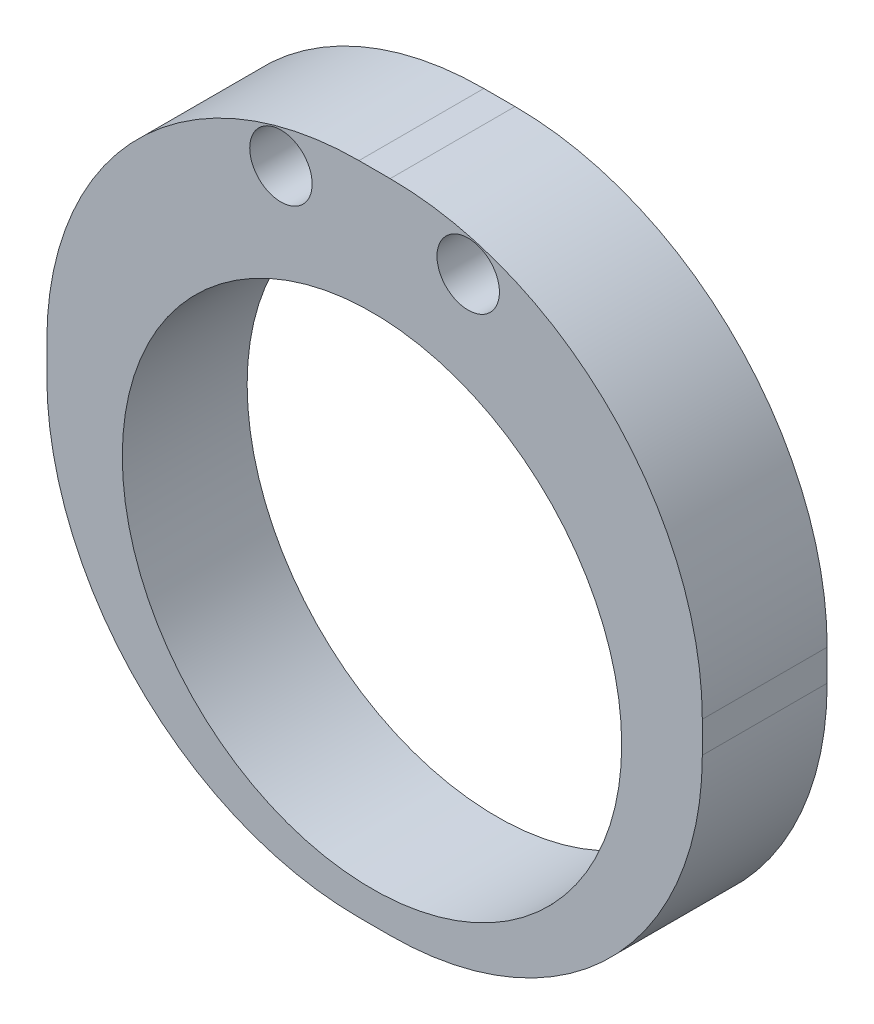
ISO-10303-21;
HEADER;
FILE_DESCRIPTION(('STEP AP214'),'2;1');
FILE_NAME('part.step','',(''),(''),'','','');
FILE_SCHEMA(('AUTOMOTIVE_DESIGN { 1 0 10303 214 1 1 1 1 }'));
ENDSEC;
DATA;
#1=APPLICATION_CONTEXT('core data for automotive mechanical design processes');
#2=APPLICATION_PROTOCOL_DEFINITION('international standard','automotive_design',2000,#1);
#3=PRODUCT_CONTEXT('',#1,'mechanical');
#4=PRODUCT('Part','Part','',(#3));
#5=PRODUCT_RELATED_PRODUCT_CATEGORY('part','',(#4));
#6=PRODUCT_DEFINITION_FORMATION('','',#4);
#7=PRODUCT_DEFINITION_CONTEXT('part definition',#1,'design');
#8=PRODUCT_DEFINITION('design','',#6,#7);
#9=PRODUCT_DEFINITION_SHAPE('','',#8);
#10=(LENGTH_UNIT() NAMED_UNIT(*) SI_UNIT(.MILLI.,.METRE.));
#11=(NAMED_UNIT(*) PLANE_ANGLE_UNIT() SI_UNIT($,.RADIAN.));
#12=(NAMED_UNIT(*) SI_UNIT($,.STERADIAN.) SOLID_ANGLE_UNIT());
#13=UNCERTAINTY_MEASURE_WITH_UNIT(LENGTH_MEASURE(1.E-05),#10,'distance_accuracy_value','');
#14=(GEOMETRIC_REPRESENTATION_CONTEXT(3) GLOBAL_UNCERTAINTY_ASSIGNED_CONTEXT((#13)) GLOBAL_UNIT_ASSIGNED_CONTEXT((#10,
#11,#12)) REPRESENTATION_CONTEXT('',''));
#15=CARTESIAN_POINT('',(0.,0.,0.));
#16=DIRECTION('',(0.,0.,1.));
#17=DIRECTION('',(1.,0.,0.));
#18=AXIS2_PLACEMENT_3D('',#15,#16,#17);
#19=CARTESIAN_POINT('',(-104.778504727155,56.6461722523179,20.));
#20=DIRECTION('',(1.,0.,0.));
#21=DIRECTION('',(0.,1.,0.));
#22=AXIS2_PLACEMENT_3D('',#19,#20,#21);
#23=PLANE('',#22);
#24=DIRECTION('',(0.,-1.,0.));
#25=VECTOR('',#24,1.);
#26=CARTESIAN_POINT('',(-104.778504727155,56.6461722523179,0.));
#27=LINE('',#26,#25);
#28=CARTESIAN_POINT('',(-104.778504727155,6.64617225231788,0.));
#29=VERTEX_POINT('',#28);
#30=CARTESIAN_POINT('',(-104.778504727155,1.64617225231788,0.));
#31=VERTEX_POINT('',#30);
#32=EDGE_CURVE('E159',#29,#31,#27,.T.);
#33=ORIENTED_EDGE('',*,*,#32,.T.);
#34=DIRECTION('',(0.,0.,-1.));
#35=VECTOR('',#34,1.);
#36=CARTESIAN_POINT('',(-104.778504727155,1.64617225231788,20.));
#37=LINE('',#36,#35);
#38=CARTESIAN_POINT('',(-104.778504727155,1.64617225231788,20.));
#39=VERTEX_POINT('',#38);
#40=EDGE_CURVE('E11',#31,#39,#37,.F.);
#41=ORIENTED_EDGE('',*,*,#40,.T.);
#42=DIRECTION('',(0.,-1.,0.));
#43=VECTOR('',#42,1.);
#44=CARTESIAN_POINT('',(-104.778504727155,56.6461722523179,20.));
#45=LINE('',#44,#43);
#46=CARTESIAN_POINT('',(-104.778504727155,6.64617225231788,20.));
#47=VERTEX_POINT('',#46);
#48=EDGE_CURVE('E127',#47,#39,#45,.T.);
#49=ORIENTED_EDGE('',*,*,#48,.F.);
#50=DIRECTION('',(0.,0.,-1.));
#51=VECTOR('',#50,1.);
#52=CARTESIAN_POINT('',(-104.778504727155,6.64617225231788,20.));
#53=LINE('',#52,#51);
#54=EDGE_CURVE('E43',#47,#29,#53,.T.);
#55=ORIENTED_EDGE('',*,*,#54,.T.);
#56=EDGE_LOOP('',(#33,#41,#49,#55));
#57=FACE_BOUND('',#56,.T.);
#58=ADVANCED_FACE('F35',(#57),#23,.F.);
#59=CARTESIAN_POINT('',(-104.778504727155,-48.3538277476821,20.));
#60=DIRECTION('',(0.,1.,0.));
#61=DIRECTION('',(0.,0.,1.));
#62=AXIS2_PLACEMENT_3D('',#59,#60,#61);
#63=PLANE('',#62);
#64=DIRECTION('',(1.,0.,0.));
#65=VECTOR('',#64,1.);
#66=CARTESIAN_POINT('',(-104.778504727155,-48.3538277476821,0.));
#67=LINE('',#66,#65);
#68=CARTESIAN_POINT('',(-54.7785047271554,-48.3538277476821,0.));
#69=VERTEX_POINT('',#68);
#70=CARTESIAN_POINT('',(-49.7785047271555,-48.3538277476821,0.));
#71=VERTEX_POINT('',#70);
#72=EDGE_CURVE('E132',#69,#71,#67,.T.);
#73=ORIENTED_EDGE('',*,*,#72,.T.);
#74=DIRECTION('',(0.,0.,-1.));
#75=VECTOR('',#74,1.);
#76=CARTESIAN_POINT('',(-49.7785047271555,-48.3538277476821,20.));
#77=LINE('',#76,#75);
#78=CARTESIAN_POINT('',(-49.7785047271555,-48.3538277476821,20.));
#79=VERTEX_POINT('',#78);
#80=EDGE_CURVE('E50',#71,#79,#77,.F.);
#81=ORIENTED_EDGE('',*,*,#80,.T.);
#82=DIRECTION('',(1.,0.,0.));
#83=VECTOR('',#82,1.);
#84=CARTESIAN_POINT('',(-104.778504727155,-48.3538277476821,20.));
#85=LINE('',#84,#83);
#86=CARTESIAN_POINT('',(-54.7785047271554,-48.3538277476821,20.));
#87=VERTEX_POINT('',#86);
#88=EDGE_CURVE('E130',#87,#79,#85,.T.);
#89=ORIENTED_EDGE('',*,*,#88,.F.);
#90=DIRECTION('',(0.,0.,-1.));
#91=VECTOR('',#90,1.);
#92=CARTESIAN_POINT('',(-54.7785047271554,-48.3538277476821,20.));
#93=LINE('',#92,#91);
#94=EDGE_CURVE('E151',#87,#69,#93,.T.);
#95=ORIENTED_EDGE('',*,*,#94,.T.);
#96=EDGE_LOOP('',(#73,#81,#89,#95));
#97=FACE_BOUND('',#96,.T.);
#98=ADVANCED_FACE('F220',(#97),#63,.F.);
#99=CARTESIAN_POINT('',(0.221495272844544,56.6461722523179,20.));
#100=DIRECTION('',(-1.,0.,0.));
#101=DIRECTION('',(0.,-1.,0.));
#102=AXIS2_PLACEMENT_3D('',#99,#100,#101);
#103=PLANE('',#102);
#104=DIRECTION('',(0.,1.,0.));
#105=VECTOR('',#104,1.);
#106=CARTESIAN_POINT('',(0.221495272844544,56.6461722523179,0.));
#107=LINE('',#106,#105);
#108=CARTESIAN_POINT('',(0.22149527284455,1.6461722523179,0.));
#109=VERTEX_POINT('',#108);
#110=CARTESIAN_POINT('',(0.221495272844549,6.64617225231789,0.));
#111=VERTEX_POINT('',#110);
#112=EDGE_CURVE('E128',#109,#111,#107,.T.);
#113=ORIENTED_EDGE('',*,*,#112,.T.);
#114=DIRECTION('',(0.,0.,-1.));
#115=VECTOR('',#114,1.);
#116=CARTESIAN_POINT('',(0.221495272844549,6.64617225231789,20.));
#117=LINE('',#116,#115);
#118=CARTESIAN_POINT('',(0.221495272844549,6.64617225231789,20.));
#119=VERTEX_POINT('',#118);
#120=EDGE_CURVE('E106',#111,#119,#117,.F.);
#121=ORIENTED_EDGE('',*,*,#120,.T.);
#122=DIRECTION('',(0.,1.,0.));
#123=VECTOR('',#122,1.);
#124=CARTESIAN_POINT('',(0.221495272844544,56.6461722523179,20.));
#125=LINE('',#124,#123);
#126=CARTESIAN_POINT('',(0.22149527284455,1.6461722523179,20.));
#127=VERTEX_POINT('',#126);
#128=EDGE_CURVE('E171',#127,#119,#125,.T.);
#129=ORIENTED_EDGE('',*,*,#128,.F.);
#130=DIRECTION('',(0.,0.,-1.));
#131=VECTOR('',#130,1.);
#132=CARTESIAN_POINT('',(0.22149527284455,1.6461722523179,20.));
#133=LINE('',#132,#131);
#134=EDGE_CURVE('E111',#127,#109,#133,.T.);
#135=ORIENTED_EDGE('',*,*,#134,.T.);
#136=EDGE_LOOP('',(#113,#121,#129,#135));
#137=FACE_BOUND('',#136,.T.);
#138=ADVANCED_FACE('F226',(#137),#103,.F.);
#139=CARTESIAN_POINT('',(-104.778504727155,56.6461722523179,20.));
#140=DIRECTION('',(0.,-1.,0.));
#141=DIRECTION('',(0.,0.,-1.));
#142=AXIS2_PLACEMENT_3D('',#139,#140,#141);
#143=PLANE('',#142);
#144=DIRECTION('',(-1.,0.,0.));
#145=VECTOR('',#144,1.);
#146=CARTESIAN_POINT('',(-104.778504727155,56.6461722523179,20.));
#147=LINE('',#146,#145);
#148=CARTESIAN_POINT('',(-49.7785047271555,56.6461722523179,20.));
#149=VERTEX_POINT('',#148);
#150=CARTESIAN_POINT('',(-54.7785047271554,56.6461722523179,20.));
#151=VERTEX_POINT('',#150);
#152=EDGE_CURVE('E121',#149,#151,#147,.T.);
#153=ORIENTED_EDGE('',*,*,#152,.F.);
#154=DIRECTION('',(0.,0.,-1.));
#155=VECTOR('',#154,1.);
#156=CARTESIAN_POINT('',(-49.7785047271555,56.6461722523179,20.));
#157=LINE('',#156,#155);
#158=CARTESIAN_POINT('',(-49.7785047271555,56.6461722523179,0.));
#159=VERTEX_POINT('',#158);
#160=EDGE_CURVE('E105',#149,#159,#157,.T.);
#161=ORIENTED_EDGE('',*,*,#160,.T.);
#162=DIRECTION('',(-1.,0.,0.));
#163=VECTOR('',#162,1.);
#164=CARTESIAN_POINT('',(-104.778504727155,56.6461722523179,0.));
#165=LINE('',#164,#163);
#166=CARTESIAN_POINT('',(-54.7785047271554,56.6461722523179,0.));
#167=VERTEX_POINT('',#166);
#168=EDGE_CURVE('E118',#159,#167,#165,.T.);
#169=ORIENTED_EDGE('',*,*,#168,.T.);
#170=DIRECTION('',(0.,0.,-1.));
#171=VECTOR('',#170,1.);
#172=CARTESIAN_POINT('',(-54.7785047271554,56.6461722523179,20.));
#173=LINE('',#172,#171);
#174=EDGE_CURVE('E123',#167,#151,#173,.F.);
#175=ORIENTED_EDGE('',*,*,#174,.T.);
#176=EDGE_LOOP('',(#153,#161,#169,#175));
#177=FACE_BOUND('',#176,.T.);
#178=ADVANCED_FACE('F117',(#177),#143,.F.);
#179=CARTESIAN_POINT('',(0.,0.,20.));
#180=DIRECTION('',(0.,0.,1.));
#181=DIRECTION('',(1.,0.,0.));
#182=AXIS2_PLACEMENT_3D('',#179,#180,#181);
#183=PLANE('',#182);
#184=CARTESIAN_POINT('',(-67.2785047271554,49.6461722523179,20.));
#185=DIRECTION('',(0.,0.,-1.));
#186=DIRECTION('',(-1.,0.,0.));
#187=AXIS2_PLACEMENT_3D('',#184,#185,#186);
#188=CIRCLE('',#187,4.99999999999999);
#189=CARTESIAN_POINT('',(-72.2785047271554,49.6461722523179,20.));
#190=VERTEX_POINT('',#189);
#191=EDGE_CURVE('E181',#190,#190,#188,.T.);
#192=ORIENTED_EDGE('',*,*,#191,.T.);
#193=EDGE_LOOP('',(#192));
#194=FACE_BOUND('',#193,.T.);
#195=CARTESIAN_POINT('',(-37.2785047271554,49.6461722523179,20.));
#196=DIRECTION('',(0.,0.,-1.));
#197=DIRECTION('',(-1.,0.,0.));
#198=AXIS2_PLACEMENT_3D('',#195,#196,#197);
#199=CIRCLE('',#198,4.99999999999999);
#200=CARTESIAN_POINT('',(-42.2785047271554,49.6461722523179,20.));
#201=VERTEX_POINT('',#200);
#202=EDGE_CURVE('E176',#201,#201,#199,.T.);
#203=ORIENTED_EDGE('',*,*,#202,.T.);
#204=EDGE_LOOP('',(#203));
#205=FACE_BOUND('',#204,.T.);
#206=CARTESIAN_POINT('',(-52.6921985977514,-3.34376042173842,20.));
#207=DIRECTION('',(0.,0.,-1.));
#208=DIRECTION('',(-1.,0.,0.));
#209=AXIS2_PLACEMENT_3D('',#206,#207,#208);
#210=CIRCLE('',#209,40.);
#211=CARTESIAN_POINT('',(-92.6921985977514,-3.34376042173842,20.));
#212=VERTEX_POINT('',#211);
#213=EDGE_CURVE('E164',#212,#212,#210,.T.);
#214=ORIENTED_EDGE('',*,*,#213,.T.);
#215=EDGE_LOOP('',(#214));
#216=FACE_BOUND('',#215,.T.);
#217=ORIENTED_EDGE('',*,*,#128,.T.);
#218=CARTESIAN_POINT('',(-49.7785047271555,6.64617225231789,20.));
#219=DIRECTION('',(0.,0.,1.));
#220=DIRECTION('',(1.,0.,0.));
#221=AXIS2_PLACEMENT_3D('',#218,#219,#220);
#222=CIRCLE('',#221,50.);
#223=EDGE_CURVE('E149',#119,#149,#222,.T.);
#224=ORIENTED_EDGE('',*,*,#223,.T.);
#225=ORIENTED_EDGE('',*,*,#152,.T.);
#226=CARTESIAN_POINT('',(-54.7785047271554,6.64617225231789,20.));
#227=DIRECTION('',(0.,0.,1.));
#228=DIRECTION('',(1.,0.,0.));
#229=AXIS2_PLACEMENT_3D('',#226,#227,#228);
#230=CIRCLE('',#229,50.);
#231=EDGE_CURVE('E144',#151,#47,#230,.T.);
#232=ORIENTED_EDGE('',*,*,#231,.T.);
#233=ORIENTED_EDGE('',*,*,#48,.T.);
#234=CARTESIAN_POINT('',(-54.7785047271554,1.64617225231789,20.));
#235=DIRECTION('',(0.,0.,1.));
#236=DIRECTION('',(1.,0.,0.));
#237=AXIS2_PLACEMENT_3D('',#234,#235,#236);
#238=CIRCLE('',#237,50.);
#239=EDGE_CURVE('E57',#39,#87,#238,.T.);
#240=ORIENTED_EDGE('',*,*,#239,.T.);
#241=ORIENTED_EDGE('',*,*,#88,.T.);
#242=CARTESIAN_POINT('',(-49.7785047271555,1.64617225231789,20.));
#243=DIRECTION('',(0.,0.,1.));
#244=DIRECTION('',(1.,0.,0.));
#245=AXIS2_PLACEMENT_3D('',#242,#243,#244);
#246=CIRCLE('',#245,50.);
#247=EDGE_CURVE('E147',#79,#127,#246,.T.);
#248=ORIENTED_EDGE('',*,*,#247,.T.);
#249=EDGE_LOOP('',(#217,#224,#225,#232,#233,#240,#241,#248));
#250=FACE_BOUND('',#249,.T.);
#251=ADVANCED_FACE('F190',(#194,#205,#216,#250),#183,.T.);
#252=CARTESIAN_POINT('',(0.,0.,0.));
#253=DIRECTION('',(0.,0.,1.));
#254=DIRECTION('',(1.,0.,0.));
#255=AXIS2_PLACEMENT_3D('',#252,#253,#254);
#256=PLANE('',#255);
#257=CARTESIAN_POINT('',(-67.2785047271554,49.6461722523179,0.));
#258=DIRECTION('',(0.,0.,-1.));
#259=DIRECTION('',(-1.,0.,0.));
#260=AXIS2_PLACEMENT_3D('',#257,#258,#259);
#261=CIRCLE('',#260,4.99999999999999);
#262=CARTESIAN_POINT('',(-72.2785047271554,49.6461722523179,0.));
#263=VERTEX_POINT('',#262);
#264=EDGE_CURVE('E184',#263,#263,#261,.T.);
#265=ORIENTED_EDGE('',*,*,#264,.F.);
#266=EDGE_LOOP('',(#265));
#267=FACE_BOUND('',#266,.T.);
#268=CARTESIAN_POINT('',(-37.2785047271554,49.6461722523179,0.));
#269=DIRECTION('',(0.,0.,-1.));
#270=DIRECTION('',(-1.,0.,0.));
#271=AXIS2_PLACEMENT_3D('',#268,#269,#270);
#272=CIRCLE('',#271,4.99999999999999);
#273=CARTESIAN_POINT('',(-42.2785047271554,49.6461722523179,0.));
#274=VERTEX_POINT('',#273);
#275=EDGE_CURVE('E178',#274,#274,#272,.T.);
#276=ORIENTED_EDGE('',*,*,#275,.F.);
#277=EDGE_LOOP('',(#276));
#278=FACE_BOUND('',#277,.T.);
#279=CARTESIAN_POINT('',(-52.6921985977514,-3.34376042173842,0.));
#280=DIRECTION('',(0.,0.,-1.));
#281=DIRECTION('',(-1.,0.,0.));
#282=AXIS2_PLACEMENT_3D('',#279,#280,#281);
#283=CIRCLE('',#282,40.);
#284=CARTESIAN_POINT('',(-92.6921985977514,-3.34376042173842,0.));
#285=VERTEX_POINT('',#284);
#286=EDGE_CURVE('E167',#285,#285,#283,.T.);
#287=ORIENTED_EDGE('',*,*,#286,.F.);
#288=EDGE_LOOP('',(#287));
#289=FACE_BOUND('',#288,.T.);
#290=ORIENTED_EDGE('',*,*,#168,.F.);
#291=CARTESIAN_POINT('',(-49.7785047271555,6.64617225231789,0.));
#292=DIRECTION('',(0.,0.,1.));
#293=DIRECTION('',(1.,0.,0.));
#294=AXIS2_PLACEMENT_3D('',#291,#292,#293);
#295=CIRCLE('',#294,50.);
#296=EDGE_CURVE('E101',#159,#111,#295,.F.);
#297=ORIENTED_EDGE('',*,*,#296,.T.);
#298=ORIENTED_EDGE('',*,*,#112,.F.);
#299=CARTESIAN_POINT('',(-49.7785047271555,1.64617225231789,0.));
#300=DIRECTION('',(0.,0.,1.));
#301=DIRECTION('',(1.,0.,0.));
#302=AXIS2_PLACEMENT_3D('',#299,#300,#301);
#303=CIRCLE('',#302,50.);
#304=EDGE_CURVE('E112',#109,#71,#303,.F.);
#305=ORIENTED_EDGE('',*,*,#304,.T.);
#306=ORIENTED_EDGE('',*,*,#72,.F.);
#307=CARTESIAN_POINT('',(-54.7785047271554,1.64617225231789,0.));
#308=DIRECTION('',(0.,0.,1.));
#309=DIRECTION('',(1.,0.,0.));
#310=AXIS2_PLACEMENT_3D('',#307,#308,#309);
#311=CIRCLE('',#310,50.);
#312=EDGE_CURVE('E138',#69,#31,#311,.F.);
#313=ORIENTED_EDGE('',*,*,#312,.T.);
#314=ORIENTED_EDGE('',*,*,#32,.F.);
#315=CARTESIAN_POINT('',(-54.7785047271554,6.64617225231789,0.));
#316=DIRECTION('',(0.,0.,1.));
#317=DIRECTION('',(1.,0.,0.));
#318=AXIS2_PLACEMENT_3D('',#315,#316,#317);
#319=CIRCLE('',#318,50.);
#320=EDGE_CURVE('E122',#29,#167,#319,.F.);
#321=ORIENTED_EDGE('',*,*,#320,.T.);
#322=EDGE_LOOP('',(#290,#297,#298,#305,#306,#313,#314,#321));
#323=FACE_BOUND('',#322,.T.);
#324=ADVANCED_FACE('F125',(#267,#278,#289,#323),#256,.F.);
#325=CARTESIAN_POINT('',(-52.6921985977514,-3.34376042173842,20.));
#326=DIRECTION('',(0.,0.,-1.));
#327=DIRECTION('',(-1.,0.,0.));
#328=AXIS2_PLACEMENT_3D('',#325,#326,#327);
#329=CYLINDRICAL_SURFACE('',#328,40.);
#330=ORIENTED_EDGE('',*,*,#213,.F.);
#331=EDGE_LOOP('',(#330));
#332=FACE_BOUND('',#331,.T.);
#333=ORIENTED_EDGE('',*,*,#286,.T.);
#334=EDGE_LOOP('',(#333));
#335=FACE_BOUND('',#334,.T.);
#336=ADVANCED_FACE('F202',(#332,#335),#329,.F.);
#337=CARTESIAN_POINT('',(-37.2785047271554,49.6461722523179,20.));
#338=DIRECTION('',(0.,0.,-1.));
#339=DIRECTION('',(-1.,0.,0.));
#340=AXIS2_PLACEMENT_3D('',#337,#338,#339);
#341=CYLINDRICAL_SURFACE('',#340,4.99999999999999);
#342=ORIENTED_EDGE('',*,*,#202,.F.);
#343=EDGE_LOOP('',(#342));
#344=FACE_BOUND('',#343,.T.);
#345=ORIENTED_EDGE('',*,*,#275,.T.);
#346=EDGE_LOOP('',(#345));
#347=FACE_BOUND('',#346,.T.);
#348=ADVANCED_FACE('F196',(#344,#347),#341,.F.);
#349=CARTESIAN_POINT('',(-67.2785047271554,49.6461722523179,20.));
#350=DIRECTION('',(0.,0.,-1.));
#351=DIRECTION('',(-1.,0.,0.));
#352=AXIS2_PLACEMENT_3D('',#349,#350,#351);
#353=CYLINDRICAL_SURFACE('',#352,4.99999999999999);
#354=ORIENTED_EDGE('',*,*,#191,.F.);
#355=EDGE_LOOP('',(#354));
#356=FACE_BOUND('',#355,.T.);
#357=ORIENTED_EDGE('',*,*,#264,.T.);
#358=EDGE_LOOP('',(#357));
#359=FACE_BOUND('',#358,.T.);
#360=ADVANCED_FACE('F193',(#356,#359),#353,.F.);
#361=CARTESIAN_POINT('',(-49.7785047271555,6.64617225231789,20.));
#362=DIRECTION('',(0.,0.,-1.));
#363=DIRECTION('',(-1.,0.,0.));
#364=AXIS2_PLACEMENT_3D('',#361,#362,#363);
#365=CYLINDRICAL_SURFACE('',#364,50.);
#366=ORIENTED_EDGE('',*,*,#223,.F.);
#367=ORIENTED_EDGE('',*,*,#120,.F.);
#368=ORIENTED_EDGE('',*,*,#296,.F.);
#369=ORIENTED_EDGE('',*,*,#160,.F.);
#370=EDGE_LOOP('',(#366,#367,#368,#369));
#371=FACE_BOUND('',#370,.T.);
#372=ADVANCED_FACE('F104',(#371),#365,.T.);
#373=CARTESIAN_POINT('',(-49.7785047271555,1.64617225231789,20.));
#374=DIRECTION('',(0.,0.,-1.));
#375=DIRECTION('',(-1.,0.,0.));
#376=AXIS2_PLACEMENT_3D('',#373,#374,#375);
#377=CYLINDRICAL_SURFACE('',#376,50.);
#378=ORIENTED_EDGE('',*,*,#247,.F.);
#379=ORIENTED_EDGE('',*,*,#80,.F.);
#380=ORIENTED_EDGE('',*,*,#304,.F.);
#381=ORIENTED_EDGE('',*,*,#134,.F.);
#382=EDGE_LOOP('',(#378,#379,#380,#381));
#383=FACE_BOUND('',#382,.T.);
#384=ADVANCED_FACE('F232',(#383),#377,.T.);
#385=CARTESIAN_POINT('',(-54.7785047271554,1.64617225231789,20.));
#386=DIRECTION('',(0.,0.,-1.));
#387=DIRECTION('',(-1.,0.,0.));
#388=AXIS2_PLACEMENT_3D('',#385,#386,#387);
#389=CYLINDRICAL_SURFACE('',#388,50.);
#390=ORIENTED_EDGE('',*,*,#239,.F.);
#391=ORIENTED_EDGE('',*,*,#40,.F.);
#392=ORIENTED_EDGE('',*,*,#312,.F.);
#393=ORIENTED_EDGE('',*,*,#94,.F.);
#394=EDGE_LOOP('',(#390,#391,#392,#393));
#395=FACE_BOUND('',#394,.T.);
#396=ADVANCED_FACE('F234',(#395),#389,.T.);
#397=CARTESIAN_POINT('',(-54.7785047271554,6.64617225231789,20.));
#398=DIRECTION('',(0.,0.,-1.));
#399=DIRECTION('',(-1.,0.,0.));
#400=AXIS2_PLACEMENT_3D('',#397,#398,#399);
#401=CYLINDRICAL_SURFACE('',#400,50.);
#402=ORIENTED_EDGE('',*,*,#231,.F.);
#403=ORIENTED_EDGE('',*,*,#174,.F.);
#404=ORIENTED_EDGE('',*,*,#320,.F.);
#405=ORIENTED_EDGE('',*,*,#54,.F.);
#406=EDGE_LOOP('',(#402,#403,#404,#405));
#407=FACE_BOUND('',#406,.T.);
#408=ADVANCED_FACE('F37',(#407),#401,.T.);
#409=CLOSED_SHELL('',(#58,#98,#138,#178,#251,#324,#336,#348,#360,#372,#384,#396,#408));
#410=MANIFOLD_SOLID_BREP('B2',#409);
#411=ADVANCED_BREP_SHAPE_REPRESENTATION('',(#18,#410),#14);
#412=SHAPE_DEFINITION_REPRESENTATION(#9,#411);
ENDSEC;
END-ISO-10303-21;
